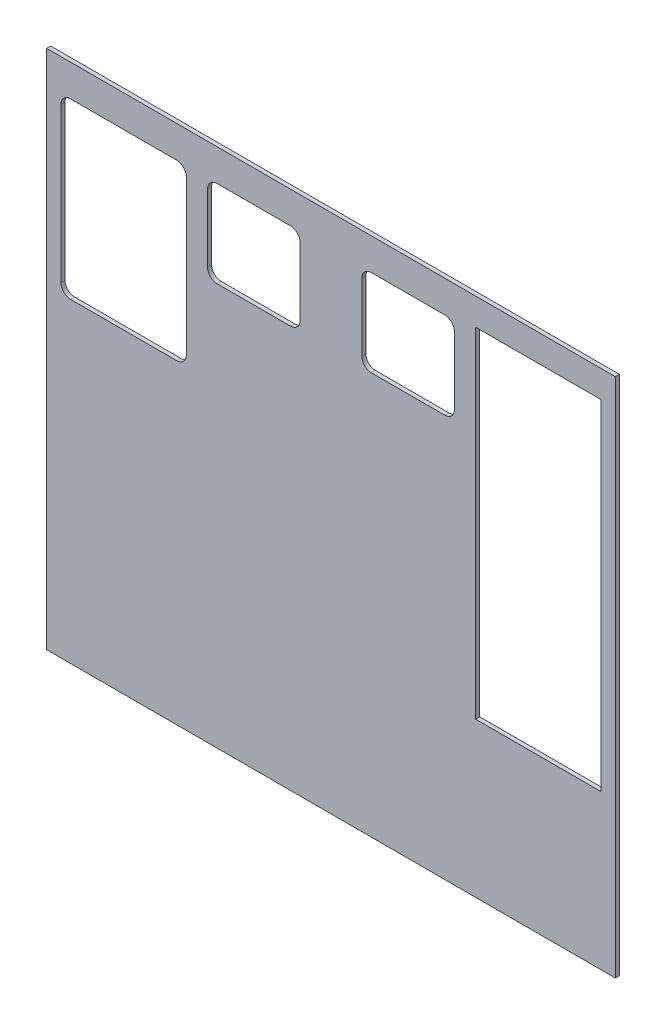
ISO-10303-21;
HEADER;
FILE_DESCRIPTION(('STEP AP214'),'2;1');
FILE_NAME('part.step','',(''),(''),'','','');
FILE_SCHEMA(('AUTOMOTIVE_DESIGN { 1 0 10303 214 1 1 1 1 }'));
ENDSEC;
DATA;
#1=APPLICATION_CONTEXT('core data for automotive mechanical design processes');
#2=APPLICATION_PROTOCOL_DEFINITION('international standard','automotive_design',2000,#1);
#3=PRODUCT_CONTEXT('',#1,'mechanical');
#4=PRODUCT('Part','Part','',(#3));
#5=PRODUCT_RELATED_PRODUCT_CATEGORY('part','',(#4));
#6=PRODUCT_DEFINITION_FORMATION('','',#4);
#7=PRODUCT_DEFINITION_CONTEXT('part definition',#1,'design');
#8=PRODUCT_DEFINITION('design','',#6,#7);
#9=PRODUCT_DEFINITION_SHAPE('','',#8);
#10=(LENGTH_UNIT() NAMED_UNIT(*) SI_UNIT(.MILLI.,.METRE.));
#11=(NAMED_UNIT(*) PLANE_ANGLE_UNIT() SI_UNIT($,.RADIAN.));
#12=(NAMED_UNIT(*) SI_UNIT($,.STERADIAN.) SOLID_ANGLE_UNIT());
#13=UNCERTAINTY_MEASURE_WITH_UNIT(LENGTH_MEASURE(1.E-05),#10,'distance_accuracy_value','');
#14=(GEOMETRIC_REPRESENTATION_CONTEXT(3) GLOBAL_UNCERTAINTY_ASSIGNED_CONTEXT((#13)) GLOBAL_UNIT_ASSIGNED_CONTEXT((#10,
#11,#12)) REPRESENTATION_CONTEXT('',''));
#15=CARTESIAN_POINT('',(0.,0.,0.));
#16=DIRECTION('',(0.,0.,1.));
#17=DIRECTION('',(1.,0.,0.));
#18=AXIS2_PLACEMENT_3D('',#15,#16,#17);
#19=CARTESIAN_POINT('',(0.,0.,2.667));
#20=DIRECTION('',(0.,-1.,0.));
#21=DIRECTION('',(1.,0.,0.));
#22=AXIS2_PLACEMENT_3D('',#19,#20,#21);
#23=PLANE('',#22);
#24=DIRECTION('',(0.,0.,1.));
#25=VECTOR('',#24,1.);
#26=CARTESIAN_POINT('',(-187.198,0.,0.));
#27=LINE('',#26,#25);
#28=CARTESIAN_POINT('',(-187.198,0.,0.));
#29=VERTEX_POINT('',#28);
#30=CARTESIAN_POINT('',(-187.198,0.,2.667));
#31=VERTEX_POINT('',#30);
#32=EDGE_CURVE('E843',#29,#31,#27,.T.);
#33=ORIENTED_EDGE('',*,*,#32,.F.);
#34=DIRECTION('',(-1.,0.,0.));
#35=VECTOR('',#34,1.);
#36=CARTESIAN_POINT('',(0.,0.,0.));
#37=LINE('',#36,#35);
#38=CARTESIAN_POINT('',(187.198,0.,0.));
#39=VERTEX_POINT('',#38);
#40=EDGE_CURVE('E317',#39,#29,#37,.T.);
#41=ORIENTED_EDGE('',*,*,#40,.F.);
#42=DIRECTION('',(0.,0.,1.));
#43=VECTOR('',#42,1.);
#44=CARTESIAN_POINT('',(187.198,0.,0.));
#45=LINE('',#44,#43);
#46=CARTESIAN_POINT('',(187.198,0.,2.667));
#47=VERTEX_POINT('',#46);
#48=EDGE_CURVE('E54',#39,#47,#45,.T.);
#49=ORIENTED_EDGE('',*,*,#48,.T.);
#50=DIRECTION('',(-1.,0.,0.));
#51=VECTOR('',#50,1.);
#52=CARTESIAN_POINT('',(0.,0.,2.667));
#53=LINE('',#52,#51);
#54=EDGE_CURVE('E478',#47,#31,#53,.T.);
#55=ORIENTED_EDGE('',*,*,#54,.T.);
#56=EDGE_LOOP('',(#33,#41,#49,#55));
#57=FACE_BOUND('',#56,.T.);
#58=ADVANCED_FACE('F37',(#57),#23,.T.);
#59=CARTESIAN_POINT('',(3.7031781150326E-13,321.945,2.667));
#60=DIRECTION('',(0.,-1.,0.));
#61=DIRECTION('',(1.,0.,0.));
#62=AXIS2_PLACEMENT_3D('',#59,#60,#61);
#63=PLANE('',#62);
#64=DIRECTION('',(-1.,0.,0.));
#65=VECTOR('',#64,1.);
#66=CARTESIAN_POINT('',(3.7031781150326E-13,321.945,0.));
#67=LINE('',#66,#65);
#68=CARTESIAN_POINT('',(74.93,321.945,0.));
#69=VERTEX_POINT('',#68);
#70=CARTESIAN_POINT('',(26.67,321.945,0.));
#71=VERTEX_POINT('',#70);
#72=EDGE_CURVE('E332',#69,#71,#67,.T.);
#73=ORIENTED_EDGE('',*,*,#72,.F.);
#74=DIRECTION('',(0.,0.,-1.));
#75=VECTOR('',#74,1.);
#76=CARTESIAN_POINT('',(74.93,321.945,2.667));
#77=LINE('',#76,#75);
#78=CARTESIAN_POINT('',(74.93,321.945,2.667));
#79=VERTEX_POINT('',#78);
#80=EDGE_CURVE('E11',#79,#69,#77,.T.);
#81=ORIENTED_EDGE('',*,*,#80,.F.);
#82=DIRECTION('',(-1.,0.,0.));
#83=VECTOR('',#82,1.);
#84=CARTESIAN_POINT('',(3.7031781150326E-13,321.945,2.667));
#85=LINE('',#84,#83);
#86=CARTESIAN_POINT('',(26.67,321.945,2.667));
#87=VERTEX_POINT('',#86);
#88=EDGE_CURVE('E492',#79,#87,#85,.T.);
#89=ORIENTED_EDGE('',*,*,#88,.T.);
#90=DIRECTION('',(0.,0.,-1.));
#91=VECTOR('',#90,1.);
#92=CARTESIAN_POINT('',(26.67,321.945,2.667));
#93=LINE('',#92,#91);
#94=EDGE_CURVE('E156',#87,#71,#93,.T.);
#95=ORIENTED_EDGE('',*,*,#94,.T.);
#96=EDGE_LOOP('',(#73,#81,#89,#95));
#97=FACE_BOUND('',#96,.T.);
#98=ADVANCED_FACE('F512',(#97),#63,.T.);
#99=CARTESIAN_POINT('',(74.93,315.595,2.667));
#100=DIRECTION('',(0.,0.,-1.));
#101=DIRECTION('',(-1.,0.,0.));
#102=AXIS2_PLACEMENT_3D('',#99,#100,#101);
#103=CYLINDRICAL_SURFACE('',#102,6.35000000000002);
#104=CARTESIAN_POINT('',(74.93,315.595,0.));
#105=DIRECTION('',(0.,0.,1.));
#106=DIRECTION('',(1.,0.,0.));
#107=AXIS2_PLACEMENT_3D('',#104,#105,#106);
#108=CIRCLE('',#107,6.35000000000002);
#109=CARTESIAN_POINT('',(81.28,315.595,0.));
#110=VERTEX_POINT('',#109);
#111=EDGE_CURVE('E335',#69,#110,#108,.F.);
#112=ORIENTED_EDGE('',*,*,#111,.T.);
#113=DIRECTION('',(0.,0.,-1.));
#114=VECTOR('',#113,1.);
#115=CARTESIAN_POINT('',(81.28,315.595,2.667));
#116=LINE('',#115,#114);
#117=CARTESIAN_POINT('',(81.28,315.595,2.667));
#118=VERTEX_POINT('',#117);
#119=EDGE_CURVE('E46',#118,#110,#116,.T.);
#120=ORIENTED_EDGE('',*,*,#119,.F.);
#121=CARTESIAN_POINT('',(74.93,315.595,2.667));
#122=DIRECTION('',(0.,0.,1.));
#123=DIRECTION('',(1.,0.,0.));
#124=AXIS2_PLACEMENT_3D('',#121,#122,#123);
#125=CIRCLE('',#124,6.35000000000002);
#126=EDGE_CURVE('E494',#79,#118,#125,.F.);
#127=ORIENTED_EDGE('',*,*,#126,.F.);
#128=ORIENTED_EDGE('',*,*,#80,.T.);
#129=EDGE_LOOP('',(#112,#120,#127,#128));
#130=FACE_BOUND('',#129,.T.);
#131=ADVANCED_FACE('F516',(#130),#103,.F.);
#132=CARTESIAN_POINT('',(81.2799999999999,0.,2.667));
#133=DIRECTION('',(1.,0.,0.));
#134=DIRECTION('',(0.,1.,0.));
#135=AXIS2_PLACEMENT_3D('',#132,#133,#134);
#136=PLANE('',#135);
#137=DIRECTION('',(0.,-1.,0.));
#138=VECTOR('',#137,1.);
#139=CARTESIAN_POINT('',(81.2799999999999,0.,0.));
#140=LINE('',#139,#138);
#141=CARTESIAN_POINT('',(81.28,271.145,0.));
#142=VERTEX_POINT('',#141);
#143=EDGE_CURVE('E338',#110,#142,#140,.T.);
#144=ORIENTED_EDGE('',*,*,#143,.T.);
#145=DIRECTION('',(0.,0.,-1.));
#146=VECTOR('',#145,1.);
#147=CARTESIAN_POINT('',(81.28,271.145,2.667));
#148=LINE('',#147,#146);
#149=CARTESIAN_POINT('',(81.28,271.145,2.667));
#150=VERTEX_POINT('',#149);
#151=EDGE_CURVE('E360',#150,#142,#148,.T.);
#152=ORIENTED_EDGE('',*,*,#151,.F.);
#153=DIRECTION('',(0.,-1.,0.));
#154=VECTOR('',#153,1.);
#155=CARTESIAN_POINT('',(81.2799999999999,0.,2.667));
#156=LINE('',#155,#154);
#157=EDGE_CURVE('E497',#118,#150,#156,.T.);
#158=ORIENTED_EDGE('',*,*,#157,.F.);
#159=ORIENTED_EDGE('',*,*,#119,.T.);
#160=EDGE_LOOP('',(#144,#152,#158,#159));
#161=FACE_BOUND('',#160,.T.);
#162=ADVANCED_FACE('F518',(#161),#136,.F.);
#163=CARTESIAN_POINT('',(74.93,271.145,2.667));
#164=DIRECTION('',(0.,0.,-1.));
#165=DIRECTION('',(-1.,0.,0.));
#166=AXIS2_PLACEMENT_3D('',#163,#164,#165);
#167=CYLINDRICAL_SURFACE('',#166,6.35000000000001);
#168=CARTESIAN_POINT('',(74.93,271.145,0.));
#169=DIRECTION('',(0.,0.,1.));
#170=DIRECTION('',(1.,0.,0.));
#171=AXIS2_PLACEMENT_3D('',#168,#169,#170);
#172=CIRCLE('',#171,6.35000000000001);
#173=CARTESIAN_POINT('',(74.93,264.795,0.));
#174=VERTEX_POINT('',#173);
#175=EDGE_CURVE('E341',#142,#174,#172,.F.);
#176=ORIENTED_EDGE('',*,*,#175,.T.);
#177=DIRECTION('',(0.,0.,-1.));
#178=VECTOR('',#177,1.);
#179=CARTESIAN_POINT('',(74.93,264.795,2.667));
#180=LINE('',#179,#178);
#181=CARTESIAN_POINT('',(74.93,264.795,2.667));
#182=VERTEX_POINT('',#181);
#183=EDGE_CURVE('E357',#182,#174,#180,.T.);
#184=ORIENTED_EDGE('',*,*,#183,.F.);
#185=CARTESIAN_POINT('',(74.93,271.145,2.667));
#186=DIRECTION('',(0.,0.,1.));
#187=DIRECTION('',(1.,0.,0.));
#188=AXIS2_PLACEMENT_3D('',#185,#186,#187);
#189=CIRCLE('',#188,6.35000000000001);
#190=EDGE_CURVE('E500',#150,#182,#189,.F.);
#191=ORIENTED_EDGE('',*,*,#190,.F.);
#192=ORIENTED_EDGE('',*,*,#151,.T.);
#193=EDGE_LOOP('',(#176,#184,#191,#192));
#194=FACE_BOUND('',#193,.T.);
#195=ADVANCED_FACE('F504',(#194),#167,.F.);
#196=CARTESIAN_POINT('',(3.04580921887296E-13,264.795,2.667));
#197=DIRECTION('',(0.,-1.,0.));
#198=DIRECTION('',(1.,0.,0.));
#199=AXIS2_PLACEMENT_3D('',#196,#197,#198);
#200=PLANE('',#199);
#201=DIRECTION('',(-1.,0.,0.));
#202=VECTOR('',#201,1.);
#203=CARTESIAN_POINT('',(3.04580921887296E-13,264.795,0.));
#204=LINE('',#203,#202);
#205=CARTESIAN_POINT('',(26.67,264.795,0.));
#206=VERTEX_POINT('',#205);
#207=EDGE_CURVE('E344',#174,#206,#204,.T.);
#208=ORIENTED_EDGE('',*,*,#207,.T.);
#209=DIRECTION('',(0.,0.,-1.));
#210=VECTOR('',#209,1.);
#211=CARTESIAN_POINT('',(26.67,264.795,2.667));
#212=LINE('',#211,#210);
#213=CARTESIAN_POINT('',(26.67,264.795,2.667));
#214=VERTEX_POINT('',#213);
#215=EDGE_CURVE('E259',#214,#206,#212,.T.);
#216=ORIENTED_EDGE('',*,*,#215,.F.);
#217=DIRECTION('',(-1.,0.,0.));
#218=VECTOR('',#217,1.);
#219=CARTESIAN_POINT('',(3.04580921887296E-13,264.795,2.667));
#220=LINE('',#219,#218);
#221=EDGE_CURVE('E247',#182,#214,#220,.T.);
#222=ORIENTED_EDGE('',*,*,#221,.F.);
#223=ORIENTED_EDGE('',*,*,#183,.T.);
#224=EDGE_LOOP('',(#208,#216,#222,#223));
#225=FACE_BOUND('',#224,.T.);
#226=ADVANCED_FACE('F506',(#225),#200,.F.);
#227=CARTESIAN_POINT('',(26.67,271.145,2.667));
#228=DIRECTION('',(0.,0.,-1.));
#229=DIRECTION('',(-1.,0.,0.));
#230=AXIS2_PLACEMENT_3D('',#227,#228,#229);
#231=CYLINDRICAL_SURFACE('',#230,6.35000000000001);
#232=CARTESIAN_POINT('',(26.67,271.145,0.));
#233=DIRECTION('',(0.,0.,1.));
#234=DIRECTION('',(1.,0.,0.));
#235=AXIS2_PLACEMENT_3D('',#232,#233,#234);
#236=CIRCLE('',#235,6.35000000000001);
#237=CARTESIAN_POINT('',(20.32,271.145,0.));
#238=VERTEX_POINT('',#237);
#239=EDGE_CURVE('E255',#206,#238,#236,.F.);
#240=ORIENTED_EDGE('',*,*,#239,.T.);
#241=DIRECTION('',(0.,0.,-1.));
#242=VECTOR('',#241,1.);
#243=CARTESIAN_POINT('',(20.32,271.145,2.667));
#244=LINE('',#243,#242);
#245=CARTESIAN_POINT('',(20.32,271.145,2.667));
#246=VERTEX_POINT('',#245);
#247=EDGE_CURVE('E253',#246,#238,#244,.T.);
#248=ORIENTED_EDGE('',*,*,#247,.F.);
#249=CARTESIAN_POINT('',(26.67,271.145,2.667));
#250=DIRECTION('',(0.,0.,1.));
#251=DIRECTION('',(1.,0.,0.));
#252=AXIS2_PLACEMENT_3D('',#249,#250,#251);
#253=CIRCLE('',#252,6.35000000000001);
#254=EDGE_CURVE('E241',#214,#246,#253,.F.);
#255=ORIENTED_EDGE('',*,*,#254,.F.);
#256=ORIENTED_EDGE('',*,*,#215,.T.);
#257=EDGE_LOOP('',(#240,#248,#255,#256));
#258=FACE_BOUND('',#257,.T.);
#259=ADVANCED_FACE('F254',(#258),#231,.F.);
#260=CARTESIAN_POINT('',(20.3199999999999,0.,2.667));
#261=DIRECTION('',(1.,0.,0.));
#262=DIRECTION('',(0.,1.,0.));
#263=AXIS2_PLACEMENT_3D('',#260,#261,#262);
#264=PLANE('',#263);
#265=DIRECTION('',(0.,-1.,0.));
#266=VECTOR('',#265,1.);
#267=CARTESIAN_POINT('',(20.3199999999999,0.,0.));
#268=LINE('',#267,#266);
#269=CARTESIAN_POINT('',(20.32,315.595,0.));
#270=VERTEX_POINT('',#269);
#271=EDGE_CURVE('E348',#270,#238,#268,.T.);
#272=ORIENTED_EDGE('',*,*,#271,.F.);
#273=DIRECTION('',(0.,0.,-1.));
#274=VECTOR('',#273,1.);
#275=CARTESIAN_POINT('',(20.32,315.595,2.667));
#276=LINE('',#275,#274);
#277=CARTESIAN_POINT('',(20.32,315.595,2.667));
#278=VERTEX_POINT('',#277);
#279=EDGE_CURVE('E260',#278,#270,#276,.T.);
#280=ORIENTED_EDGE('',*,*,#279,.F.);
#281=DIRECTION('',(0.,-1.,0.));
#282=VECTOR('',#281,1.);
#283=CARTESIAN_POINT('',(20.3199999999999,0.,2.667));
#284=LINE('',#283,#282);
#285=EDGE_CURVE('E245',#278,#246,#284,.T.);
#286=ORIENTED_EDGE('',*,*,#285,.T.);
#287=ORIENTED_EDGE('',*,*,#247,.T.);
#288=EDGE_LOOP('',(#272,#280,#286,#287));
#289=FACE_BOUND('',#288,.T.);
#290=ADVANCED_FACE('F262',(#289),#264,.T.);
#291=CARTESIAN_POINT('',(0.,325.12,2.667));
#292=DIRECTION('',(0.,1.,0.));
#293=DIRECTION('',(0.,0.,1.));
#294=AXIS2_PLACEMENT_3D('',#291,#292,#293);
#295=PLANE('',#294);
#296=DIRECTION('',(1.,0.,0.));
#297=VECTOR('',#296,1.);
#298=CARTESIAN_POINT('',(0.,325.12,0.));
#299=LINE('',#298,#297);
#300=CARTESIAN_POINT('',(95.25,325.12,0.));
#301=VERTEX_POINT('',#300);
#302=CARTESIAN_POINT('',(177.8,325.12,0.));
#303=VERTEX_POINT('',#302);
#304=EDGE_CURVE('E320',#301,#303,#299,.T.);
#305=ORIENTED_EDGE('',*,*,#304,.T.);
#306=DIRECTION('',(0.,0.,-1.));
#307=VECTOR('',#306,1.);
#308=CARTESIAN_POINT('',(177.8,325.12,2.667));
#309=LINE('',#308,#307);
#310=CARTESIAN_POINT('',(177.8,325.12,2.667));
#311=VERTEX_POINT('',#310);
#312=EDGE_CURVE('E354',#311,#303,#309,.T.);
#313=ORIENTED_EDGE('',*,*,#312,.F.);
#314=DIRECTION('',(1.,0.,0.));
#315=VECTOR('',#314,1.);
#316=CARTESIAN_POINT('',(0.,325.12,2.667));
#317=LINE('',#316,#315);
#318=CARTESIAN_POINT('',(95.25,325.12,2.667));
#319=VERTEX_POINT('',#318);
#320=EDGE_CURVE('E481',#319,#311,#317,.T.);
#321=ORIENTED_EDGE('',*,*,#320,.F.);
#322=DIRECTION('',(0.,0.,-1.));
#323=VECTOR('',#322,1.);
#324=CARTESIAN_POINT('',(95.25,325.12,2.667));
#325=LINE('',#324,#323);
#326=EDGE_CURVE('E365',#319,#301,#325,.T.);
#327=ORIENTED_EDGE('',*,*,#326,.T.);
#328=EDGE_LOOP('',(#305,#313,#321,#327));
#329=FACE_BOUND('',#328,.T.);
#330=ADVANCED_FACE('F537',(#329),#295,.F.);
#331=CARTESIAN_POINT('',(177.8,0.,2.667));
#332=DIRECTION('',(1.,0.,0.));
#333=DIRECTION('',(0.,0.,-1.));
#334=AXIS2_PLACEMENT_3D('',#331,#332,#333);
#335=PLANE('',#334);
#336=DIRECTION('',(0.,-1.,0.));
#337=VECTOR('',#336,1.);
#338=CARTESIAN_POINT('',(177.8,0.,0.));
#339=LINE('',#338,#337);
#340=CARTESIAN_POINT('',(177.8,101.6,0.));
#341=VERTEX_POINT('',#340);
#342=EDGE_CURVE('E323',#303,#341,#339,.T.);
#343=ORIENTED_EDGE('',*,*,#342,.T.);
#344=DIRECTION('',(0.,0.,-1.));
#345=VECTOR('',#344,1.);
#346=CARTESIAN_POINT('',(177.8,101.6,2.667));
#347=LINE('',#346,#345);
#348=CARTESIAN_POINT('',(177.8,101.6,2.667));
#349=VERTEX_POINT('',#348);
#350=EDGE_CURVE('E370',#349,#341,#347,.T.);
#351=ORIENTED_EDGE('',*,*,#350,.F.);
#352=DIRECTION('',(0.,-1.,0.));
#353=VECTOR('',#352,1.);
#354=CARTESIAN_POINT('',(177.8,0.,2.667));
#355=LINE('',#354,#353);
#356=EDGE_CURVE('E484',#311,#349,#355,.T.);
#357=ORIENTED_EDGE('',*,*,#356,.F.);
#358=ORIENTED_EDGE('',*,*,#312,.T.);
#359=EDGE_LOOP('',(#343,#351,#357,#358));
#360=FACE_BOUND('',#359,.T.);
#361=ADVANCED_FACE('F624',(#360),#335,.F.);
#362=CARTESIAN_POINT('',(0.,101.6,2.667));
#363=DIRECTION('',(0.,1.,0.));
#364=DIRECTION('',(0.,0.,1.));
#365=AXIS2_PLACEMENT_3D('',#362,#363,#364);
#366=PLANE('',#365);
#367=DIRECTION('',(1.,0.,0.));
#368=VECTOR('',#367,1.);
#369=CARTESIAN_POINT('',(0.,101.6,0.));
#370=LINE('',#369,#368);
#371=CARTESIAN_POINT('',(95.25,101.6,0.));
#372=VERTEX_POINT('',#371);
#373=EDGE_CURVE('E326',#372,#341,#370,.T.);
#374=ORIENTED_EDGE('',*,*,#373,.F.);
#375=DIRECTION('',(0.,0.,-1.));
#376=VECTOR('',#375,1.);
#377=CARTESIAN_POINT('',(95.25,101.6,2.667));
#378=LINE('',#377,#376);
#379=CARTESIAN_POINT('',(95.25,101.6,2.667));
#380=VERTEX_POINT('',#379);
#381=EDGE_CURVE('E367',#380,#372,#378,.T.);
#382=ORIENTED_EDGE('',*,*,#381,.F.);
#383=DIRECTION('',(1.,0.,0.));
#384=VECTOR('',#383,1.);
#385=CARTESIAN_POINT('',(0.,101.6,2.667));
#386=LINE('',#385,#384);
#387=EDGE_CURVE('E486',#380,#349,#386,.T.);
#388=ORIENTED_EDGE('',*,*,#387,.T.);
#389=ORIENTED_EDGE('',*,*,#350,.T.);
#390=EDGE_LOOP('',(#374,#382,#388,#389));
#391=FACE_BOUND('',#390,.T.);
#392=ADVANCED_FACE('F571',(#391),#366,.T.);
#393=CARTESIAN_POINT('',(-171.45,315.595,2.667));
#394=DIRECTION('',(0.,0.,-1.));
#395=DIRECTION('',(-1.,0.,0.));
#396=AXIS2_PLACEMENT_3D('',#393,#394,#395);
#397=CYLINDRICAL_SURFACE('',#396,6.35000000000001);
#398=CARTESIAN_POINT('',(-171.45,315.595,0.));
#399=DIRECTION('',(0.,0.,1.));
#400=DIRECTION('',(1.,0.,0.));
#401=AXIS2_PLACEMENT_3D('',#398,#399,#400);
#402=CIRCLE('',#401,6.35000000000001);
#403=CARTESIAN_POINT('',(-171.45,321.945,0.));
#404=VERTEX_POINT('',#403);
#405=CARTESIAN_POINT('',(-177.8,315.595,0.));
#406=VERTEX_POINT('',#405);
#407=EDGE_CURVE('E293',#404,#406,#402,.T.);
#408=ORIENTED_EDGE('',*,*,#407,.F.);
#409=DIRECTION('',(0.,0.,-1.));
#410=VECTOR('',#409,1.);
#411=CARTESIAN_POINT('',(-171.45,321.945,2.667));
#412=LINE('',#411,#410);
#413=CARTESIAN_POINT('',(-171.45,321.945,2.667));
#414=VERTEX_POINT('',#413);
#415=EDGE_CURVE('E368',#414,#404,#412,.T.);
#416=ORIENTED_EDGE('',*,*,#415,.F.);
#417=CARTESIAN_POINT('',(-171.45,315.595,2.667));
#418=DIRECTION('',(0.,0.,1.));
#419=DIRECTION('',(1.,0.,0.));
#420=AXIS2_PLACEMENT_3D('',#417,#418,#419);
#421=CIRCLE('',#420,6.35000000000001);
#422=CARTESIAN_POINT('',(-177.8,315.595,2.667));
#423=VERTEX_POINT('',#422);
#424=EDGE_CURVE('E456',#414,#423,#421,.T.);
#425=ORIENTED_EDGE('',*,*,#424,.T.);
#426=DIRECTION('',(0.,0.,-1.));
#427=VECTOR('',#426,1.);
#428=CARTESIAN_POINT('',(-177.8,315.595,2.667));
#429=LINE('',#428,#427);
#430=EDGE_CURVE('E374',#423,#406,#429,.T.);
#431=ORIENTED_EDGE('',*,*,#430,.T.);
#432=EDGE_LOOP('',(#408,#416,#425,#431));
#433=FACE_BOUND('',#432,.T.);
#434=ADVANCED_FACE('F567',(#433),#397,.F.);
#435=CARTESIAN_POINT('',(2.55855942493161E-13,321.945,2.667));
#436=DIRECTION('',(0.,1.,0.));
#437=DIRECTION('',(-1.,0.,0.));
#438=AXIS2_PLACEMENT_3D('',#435,#436,#437);
#439=PLANE('',#438);
#440=DIRECTION('',(1.,0.,0.));
#441=VECTOR('',#440,1.);
#442=CARTESIAN_POINT('',(2.55855942493161E-13,321.945,0.));
#443=LINE('',#442,#441);
#444=CARTESIAN_POINT('',(-101.6,321.945,0.));
#445=VERTEX_POINT('',#444);
#446=EDGE_CURVE('E296',#404,#445,#443,.T.);
#447=ORIENTED_EDGE('',*,*,#446,.T.);
#448=DIRECTION('',(0.,0.,-1.));
#449=VECTOR('',#448,1.);
#450=CARTESIAN_POINT('',(-101.6,321.945,2.667));
#451=LINE('',#450,#449);
#452=CARTESIAN_POINT('',(-101.6,321.945,2.667));
#453=VERTEX_POINT('',#452);
#454=EDGE_CURVE('E386',#453,#445,#451,.T.);
#455=ORIENTED_EDGE('',*,*,#454,.F.);
#456=DIRECTION('',(1.,0.,0.));
#457=VECTOR('',#456,1.);
#458=CARTESIAN_POINT('',(2.55855942493161E-13,321.945,2.667));
#459=LINE('',#458,#457);
#460=EDGE_CURVE('E459',#414,#453,#459,.T.);
#461=ORIENTED_EDGE('',*,*,#460,.F.);
#462=ORIENTED_EDGE('',*,*,#415,.T.);
#463=EDGE_LOOP('',(#447,#455,#461,#462));
#464=FACE_BOUND('',#463,.T.);
#465=ADVANCED_FACE('F563',(#464),#439,.F.);
#466=CARTESIAN_POINT('',(-101.6,315.595,2.667));
#467=DIRECTION('',(0.,0.,-1.));
#468=DIRECTION('',(-1.,0.,0.));
#469=AXIS2_PLACEMENT_3D('',#466,#467,#468);
#470=CYLINDRICAL_SURFACE('',#469,6.34999999999998);
#471=CARTESIAN_POINT('',(-101.6,315.595,0.));
#472=DIRECTION('',(0.,0.,1.));
#473=DIRECTION('',(1.,0.,0.));
#474=AXIS2_PLACEMENT_3D('',#471,#472,#473);
#475=CIRCLE('',#474,6.34999999999998);
#476=CARTESIAN_POINT('',(-95.2500000000002,315.595,0.));
#477=VERTEX_POINT('',#476);
#478=EDGE_CURVE('E299',#477,#445,#475,.T.);
#479=ORIENTED_EDGE('',*,*,#478,.F.);
#480=DIRECTION('',(0.,0.,-1.));
#481=VECTOR('',#480,1.);
#482=CARTESIAN_POINT('',(-95.2500000000002,315.595,2.667));
#483=LINE('',#482,#481);
#484=CARTESIAN_POINT('',(-95.2500000000002,315.595,2.667));
#485=VERTEX_POINT('',#484);
#486=EDGE_CURVE('E384',#485,#477,#483,.T.);
#487=ORIENTED_EDGE('',*,*,#486,.F.);
#488=CARTESIAN_POINT('',(-101.6,315.595,2.667));
#489=DIRECTION('',(0.,0.,1.));
#490=DIRECTION('',(1.,0.,0.));
#491=AXIS2_PLACEMENT_3D('',#488,#489,#490);
#492=CIRCLE('',#491,6.34999999999998);
#493=EDGE_CURVE('E461',#485,#453,#492,.T.);
#494=ORIENTED_EDGE('',*,*,#493,.T.);
#495=ORIENTED_EDGE('',*,*,#454,.T.);
#496=EDGE_LOOP('',(#479,#487,#494,#495));
#497=FACE_BOUND('',#496,.T.);
#498=ADVANCED_FACE('F559',(#497),#470,.F.);
#499=CARTESIAN_POINT('',(-95.2500000000002,0.,2.667));
#500=DIRECTION('',(1.,0.,0.));
#501=DIRECTION('',(0.,1.,0.));
#502=AXIS2_PLACEMENT_3D('',#499,#500,#501);
#503=PLANE('',#502);
#504=DIRECTION('',(0.,-1.,0.));
#505=VECTOR('',#504,1.);
#506=CARTESIAN_POINT('',(-95.2500000000002,0.,0.));
#507=LINE('',#506,#505);
#508=CARTESIAN_POINT('',(-95.2500000000002,213.995,0.));
#509=VERTEX_POINT('',#508);
#510=EDGE_CURVE('E302',#477,#509,#507,.T.);
#511=ORIENTED_EDGE('',*,*,#510,.T.);
#512=DIRECTION('',(0.,0.,-1.));
#513=VECTOR('',#512,1.);
#514=CARTESIAN_POINT('',(-95.2500000000002,213.995,2.667));
#515=LINE('',#514,#513);
#516=CARTESIAN_POINT('',(-95.2500000000002,213.995,2.667));
#517=VERTEX_POINT('',#516);
#518=EDGE_CURVE('E382',#517,#509,#515,.T.);
#519=ORIENTED_EDGE('',*,*,#518,.F.);
#520=DIRECTION('',(0.,-1.,0.));
#521=VECTOR('',#520,1.);
#522=CARTESIAN_POINT('',(-95.2500000000002,0.,2.667));
#523=LINE('',#522,#521);
#524=EDGE_CURVE('E464',#485,#517,#523,.T.);
#525=ORIENTED_EDGE('',*,*,#524,.F.);
#526=ORIENTED_EDGE('',*,*,#486,.T.);
#527=EDGE_LOOP('',(#511,#519,#525,#526));
#528=FACE_BOUND('',#527,.T.);
#529=ADVANCED_FACE('F555',(#528),#503,.F.);
#530=CARTESIAN_POINT('',(-101.6,213.995,2.667));
#531=DIRECTION('',(0.,0.,-1.));
#532=DIRECTION('',(-1.,0.,0.));
#533=AXIS2_PLACEMENT_3D('',#530,#531,#532);
#534=CYLINDRICAL_SURFACE('',#533,6.35000000000001);
#535=CARTESIAN_POINT('',(-101.6,213.995,0.));
#536=DIRECTION('',(0.,0.,1.));
#537=DIRECTION('',(1.,0.,0.));
#538=AXIS2_PLACEMENT_3D('',#535,#536,#537);
#539=CIRCLE('',#538,6.35000000000001);
#540=CARTESIAN_POINT('',(-101.6,207.645,0.));
#541=VERTEX_POINT('',#540);
#542=EDGE_CURVE('E305',#541,#509,#539,.T.);
#543=ORIENTED_EDGE('',*,*,#542,.F.);
#544=DIRECTION('',(0.,0.,-1.));
#545=VECTOR('',#544,1.);
#546=CARTESIAN_POINT('',(-101.6,207.645,2.667));
#547=LINE('',#546,#545);
#548=CARTESIAN_POINT('',(-101.6,207.645,2.667));
#549=VERTEX_POINT('',#548);
#550=EDGE_CURVE('E380',#549,#541,#547,.T.);
#551=ORIENTED_EDGE('',*,*,#550,.F.);
#552=CARTESIAN_POINT('',(-101.6,213.995,2.667));
#553=DIRECTION('',(0.,0.,1.));
#554=DIRECTION('',(1.,0.,0.));
#555=AXIS2_PLACEMENT_3D('',#552,#553,#554);
#556=CIRCLE('',#555,6.35000000000001);
#557=EDGE_CURVE('E466',#549,#517,#556,.T.);
#558=ORIENTED_EDGE('',*,*,#557,.T.);
#559=ORIENTED_EDGE('',*,*,#518,.T.);
#560=EDGE_LOOP('',(#543,#551,#558,#559));
#561=FACE_BOUND('',#560,.T.);
#562=ADVANCED_FACE('F551',(#561),#534,.F.);
#563=CARTESIAN_POINT('',(0.,207.645,2.667));
#564=DIRECTION('',(0.,1.,0.));
#565=DIRECTION('',(0.,0.,1.));
#566=AXIS2_PLACEMENT_3D('',#563,#564,#565);
#567=PLANE('',#566);
#568=DIRECTION('',(1.,0.,0.));
#569=VECTOR('',#568,1.);
#570=CARTESIAN_POINT('',(0.,207.645,0.));
#571=LINE('',#570,#569);
#572=CARTESIAN_POINT('',(-171.45,207.645,0.));
#573=VERTEX_POINT('',#572);
#574=EDGE_CURVE('E308',#573,#541,#571,.T.);
#575=ORIENTED_EDGE('',*,*,#574,.F.);
#576=DIRECTION('',(0.,0.,-1.));
#577=VECTOR('',#576,1.);
#578=CARTESIAN_POINT('',(-171.45,207.645,2.667));
#579=LINE('',#578,#577);
#580=CARTESIAN_POINT('',(-171.45,207.645,2.667));
#581=VERTEX_POINT('',#580);
#582=EDGE_CURVE('E378',#581,#573,#579,.T.);
#583=ORIENTED_EDGE('',*,*,#582,.F.);
#584=DIRECTION('',(1.,0.,0.));
#585=VECTOR('',#584,1.);
#586=CARTESIAN_POINT('',(0.,207.645,2.667));
#587=LINE('',#586,#585);
#588=EDGE_CURVE('E469',#581,#549,#587,.T.);
#589=ORIENTED_EDGE('',*,*,#588,.T.);
#590=ORIENTED_EDGE('',*,*,#550,.T.);
#591=EDGE_LOOP('',(#575,#583,#589,#590));
#592=FACE_BOUND('',#591,.T.);
#593=ADVANCED_FACE('F547',(#592),#567,.T.);
#594=CARTESIAN_POINT('',(-171.45,213.995,2.667));
#595=DIRECTION('',(0.,0.,-1.));
#596=DIRECTION('',(-1.,0.,0.));
#597=AXIS2_PLACEMENT_3D('',#594,#595,#596);
#598=CYLINDRICAL_SURFACE('',#597,6.35000000000004);
#599=CARTESIAN_POINT('',(-171.45,213.995,0.));
#600=DIRECTION('',(0.,0.,1.));
#601=DIRECTION('',(1.,0.,0.));
#602=AXIS2_PLACEMENT_3D('',#599,#600,#601);
#603=CIRCLE('',#602,6.35000000000004);
#604=CARTESIAN_POINT('',(-177.8,213.995,0.));
#605=VERTEX_POINT('',#604);
#606=EDGE_CURVE('E311',#605,#573,#603,.T.);
#607=ORIENTED_EDGE('',*,*,#606,.F.);
#608=DIRECTION('',(0.,0.,-1.));
#609=VECTOR('',#608,1.);
#610=CARTESIAN_POINT('',(-177.8,213.995,2.667));
#611=LINE('',#610,#609);
#612=CARTESIAN_POINT('',(-177.8,213.995,2.667));
#613=VERTEX_POINT('',#612);
#614=EDGE_CURVE('E376',#613,#605,#611,.T.);
#615=ORIENTED_EDGE('',*,*,#614,.F.);
#616=CARTESIAN_POINT('',(-171.45,213.995,2.667));
#617=DIRECTION('',(0.,0.,1.));
#618=DIRECTION('',(1.,0.,0.));
#619=AXIS2_PLACEMENT_3D('',#616,#617,#618);
#620=CIRCLE('',#619,6.35000000000004);
#621=EDGE_CURVE('E472',#613,#581,#620,.T.);
#622=ORIENTED_EDGE('',*,*,#621,.T.);
#623=ORIENTED_EDGE('',*,*,#582,.T.);
#624=EDGE_LOOP('',(#607,#615,#622,#623));
#625=FACE_BOUND('',#624,.T.);
#626=ADVANCED_FACE('F544',(#625),#598,.F.);
#627=CARTESIAN_POINT('',(-74.93,315.595,2.667));
#628=DIRECTION('',(0.,0.,-1.));
#629=DIRECTION('',(-1.,0.,0.));
#630=AXIS2_PLACEMENT_3D('',#627,#628,#629);
#631=CYLINDRICAL_SURFACE('',#630,6.35000000000002);
#632=CARTESIAN_POINT('',(-74.93,315.595,0.));
#633=DIRECTION('',(0.,0.,1.));
#634=DIRECTION('',(1.,0.,0.));
#635=AXIS2_PLACEMENT_3D('',#632,#633,#634);
#636=CIRCLE('',#635,6.35000000000002);
#637=CARTESIAN_POINT('',(-74.93,321.945,0.));
#638=VERTEX_POINT('',#637);
#639=CARTESIAN_POINT('',(-81.28,315.595,0.));
#640=VERTEX_POINT('',#639);
#641=EDGE_CURVE('E268',#638,#640,#636,.T.);
#642=ORIENTED_EDGE('',*,*,#641,.F.);
#643=DIRECTION('',(0.,0.,-1.));
#644=VECTOR('',#643,1.);
#645=CARTESIAN_POINT('',(-74.93,321.945,2.667));
#646=LINE('',#645,#644);
#647=CARTESIAN_POINT('',(-74.93,321.945,2.667));
#648=VERTEX_POINT('',#647);
#649=EDGE_CURVE('E41',#648,#638,#646,.T.);
#650=ORIENTED_EDGE('',*,*,#649,.F.);
#651=CARTESIAN_POINT('',(-74.93,315.595,2.667));
#652=DIRECTION('',(0.,0.,1.));
#653=DIRECTION('',(1.,0.,0.));
#654=AXIS2_PLACEMENT_3D('',#651,#652,#653);
#655=CIRCLE('',#654,6.35000000000002);
#656=CARTESIAN_POINT('',(-81.28,315.595,2.667));
#657=VERTEX_POINT('',#656);
#658=EDGE_CURVE('E352',#648,#657,#655,.T.);
#659=ORIENTED_EDGE('',*,*,#658,.T.);
#660=DIRECTION('',(0.,0.,-1.));
#661=VECTOR('',#660,1.);
#662=CARTESIAN_POINT('',(-81.28,315.595,2.667));
#663=LINE('',#662,#661);
#664=EDGE_CURVE('E264',#657,#640,#663,.T.);
#665=ORIENTED_EDGE('',*,*,#664,.T.);
#666=EDGE_LOOP('',(#642,#650,#659,#665));
#667=FACE_BOUND('',#666,.T.);
#668=ADVANCED_FACE('F39',(#667),#631,.F.);
#669=CARTESIAN_POINT('',(-3.7031781150326E-13,321.945,2.667));
#670=DIRECTION('',(0.,1.,0.));
#671=DIRECTION('',(-1.,0.,0.));
#672=AXIS2_PLACEMENT_3D('',#669,#670,#671);
#673=PLANE('',#672);
#674=DIRECTION('',(1.,0.,0.));
#675=VECTOR('',#674,1.);
#676=CARTESIAN_POINT('',(-3.7031781150326E-13,321.945,0.));
#677=LINE('',#676,#675);
#678=CARTESIAN_POINT('',(-26.67,321.945,0.));
#679=VERTEX_POINT('',#678);
#680=EDGE_CURVE('E271',#638,#679,#677,.T.);
#681=ORIENTED_EDGE('',*,*,#680,.T.);
#682=DIRECTION('',(0.,0.,-1.));
#683=VECTOR('',#682,1.);
#684=CARTESIAN_POINT('',(-26.67,321.945,2.667));
#685=LINE('',#684,#683);
#686=CARTESIAN_POINT('',(-26.67,321.945,2.667));
#687=VERTEX_POINT('',#686);
#688=EDGE_CURVE('E399',#687,#679,#685,.T.);
#689=ORIENTED_EDGE('',*,*,#688,.F.);
#690=DIRECTION('',(1.,0.,0.));
#691=VECTOR('',#690,1.);
#692=CARTESIAN_POINT('',(-3.7031781150326E-13,321.945,2.667));
#693=LINE('',#692,#691);
#694=EDGE_CURVE('E407',#648,#687,#693,.T.);
#695=ORIENTED_EDGE('',*,*,#694,.F.);
#696=ORIENTED_EDGE('',*,*,#649,.T.);
#697=EDGE_LOOP('',(#681,#689,#695,#696));
#698=FACE_BOUND('',#697,.T.);
#699=ADVANCED_FACE('F406',(#698),#673,.F.);
#700=CARTESIAN_POINT('',(-26.67,315.595,2.667));
#701=DIRECTION('',(0.,0.,-1.));
#702=DIRECTION('',(-1.,0.,0.));
#703=AXIS2_PLACEMENT_3D('',#700,#701,#702);
#704=CYLINDRICAL_SURFACE('',#703,6.35000000000004);
#705=CARTESIAN_POINT('',(-26.67,315.595,0.));
#706=DIRECTION('',(0.,0.,1.));
#707=DIRECTION('',(1.,0.,0.));
#708=AXIS2_PLACEMENT_3D('',#705,#706,#707);
#709=CIRCLE('',#708,6.35000000000004);
#710=CARTESIAN_POINT('',(-20.32,315.595,0.));
#711=VERTEX_POINT('',#710);
#712=EDGE_CURVE('E275',#711,#679,#709,.T.);
#713=ORIENTED_EDGE('',*,*,#712,.F.);
#714=DIRECTION('',(0.,0.,-1.));
#715=VECTOR('',#714,1.);
#716=CARTESIAN_POINT('',(-20.32,315.595,2.667));
#717=LINE('',#716,#715);
#718=CARTESIAN_POINT('',(-20.32,315.595,2.667));
#719=VERTEX_POINT('',#718);
#720=EDGE_CURVE('E398',#719,#711,#717,.T.);
#721=ORIENTED_EDGE('',*,*,#720,.F.);
#722=CARTESIAN_POINT('',(-26.67,315.595,2.667));
#723=DIRECTION('',(0.,0.,1.));
#724=DIRECTION('',(1.,0.,0.));
#725=AXIS2_PLACEMENT_3D('',#722,#723,#724);
#726=CIRCLE('',#725,6.35000000000004);
#727=EDGE_CURVE('E441',#719,#687,#726,.T.);
#728=ORIENTED_EDGE('',*,*,#727,.T.);
#729=ORIENTED_EDGE('',*,*,#688,.T.);
#730=EDGE_LOOP('',(#713,#721,#728,#729));
#731=FACE_BOUND('',#730,.T.);
#732=ADVANCED_FACE('F438',(#731),#704,.F.);
#733=CARTESIAN_POINT('',(-20.3199999999999,0.,2.667));
#734=DIRECTION('',(1.,0.,0.));
#735=DIRECTION('',(0.,1.,0.));
#736=AXIS2_PLACEMENT_3D('',#733,#734,#735);
#737=PLANE('',#736);
#738=DIRECTION('',(0.,-1.,0.));
#739=VECTOR('',#738,1.);
#740=CARTESIAN_POINT('',(-20.3199999999999,0.,0.));
#741=LINE('',#740,#739);
#742=CARTESIAN_POINT('',(-20.32,271.145,0.));
#743=VERTEX_POINT('',#742);
#744=EDGE_CURVE('E278',#711,#743,#741,.T.);
#745=ORIENTED_EDGE('',*,*,#744,.T.);
#746=DIRECTION('',(0.,0.,-1.));
#747=VECTOR('',#746,1.);
#748=CARTESIAN_POINT('',(-20.32,271.145,2.667));
#749=LINE('',#748,#747);
#750=CARTESIAN_POINT('',(-20.32,271.145,2.667));
#751=VERTEX_POINT('',#750);
#752=EDGE_CURVE('E396',#751,#743,#749,.T.);
#753=ORIENTED_EDGE('',*,*,#752,.F.);
#754=DIRECTION('',(0.,-1.,0.));
#755=VECTOR('',#754,1.);
#756=CARTESIAN_POINT('',(-20.3199999999999,0.,2.667));
#757=LINE('',#756,#755);
#758=EDGE_CURVE('E442',#719,#751,#757,.T.);
#759=ORIENTED_EDGE('',*,*,#758,.F.);
#760=ORIENTED_EDGE('',*,*,#720,.T.);
#761=EDGE_LOOP('',(#745,#753,#759,#760));
#762=FACE_BOUND('',#761,.T.);
#763=ADVANCED_FACE('F443',(#762),#737,.F.);
#764=CARTESIAN_POINT('',(-26.67,271.145,2.667));
#765=DIRECTION('',(0.,0.,-1.));
#766=DIRECTION('',(-1.,0.,0.));
#767=AXIS2_PLACEMENT_3D('',#764,#765,#766);
#768=CYLINDRICAL_SURFACE('',#767,6.35000000000001);
#769=CARTESIAN_POINT('',(-26.67,271.145,0.));
#770=DIRECTION('',(0.,0.,1.));
#771=DIRECTION('',(1.,0.,0.));
#772=AXIS2_PLACEMENT_3D('',#769,#770,#771);
#773=CIRCLE('',#772,6.35000000000001);
#774=CARTESIAN_POINT('',(-26.67,264.795,0.));
#775=VERTEX_POINT('',#774);
#776=EDGE_CURVE('E281',#775,#743,#773,.T.);
#777=ORIENTED_EDGE('',*,*,#776,.F.);
#778=DIRECTION('',(0.,0.,-1.));
#779=VECTOR('',#778,1.);
#780=CARTESIAN_POINT('',(-26.67,264.795,2.667));
#781=LINE('',#780,#779);
#782=CARTESIAN_POINT('',(-26.67,264.795,2.667));
#783=VERTEX_POINT('',#782);
#784=EDGE_CURVE('E394',#783,#775,#781,.T.);
#785=ORIENTED_EDGE('',*,*,#784,.F.);
#786=CARTESIAN_POINT('',(-26.67,271.145,2.667));
#787=DIRECTION('',(0.,0.,1.));
#788=DIRECTION('',(1.,0.,0.));
#789=AXIS2_PLACEMENT_3D('',#786,#787,#788);
#790=CIRCLE('',#789,6.35000000000001);
#791=EDGE_CURVE('E445',#783,#751,#790,.T.);
#792=ORIENTED_EDGE('',*,*,#791,.T.);
#793=ORIENTED_EDGE('',*,*,#752,.T.);
#794=EDGE_LOOP('',(#777,#785,#792,#793));
#795=FACE_BOUND('',#794,.T.);
#796=ADVANCED_FACE('F435',(#795),#768,.F.);
#797=CARTESIAN_POINT('',(-3.04580921887296E-13,264.795,2.667));
#798=DIRECTION('',(0.,1.,0.));
#799=DIRECTION('',(-1.,0.,0.));
#800=AXIS2_PLACEMENT_3D('',#797,#798,#799);
#801=PLANE('',#800);
#802=DIRECTION('',(1.,0.,0.));
#803=VECTOR('',#802,1.);
#804=CARTESIAN_POINT('',(-3.04580921887296E-13,264.795,0.));
#805=LINE('',#804,#803);
#806=CARTESIAN_POINT('',(-74.93,264.795,0.));
#807=VERTEX_POINT('',#806);
#808=EDGE_CURVE('E284',#807,#775,#805,.T.);
#809=ORIENTED_EDGE('',*,*,#808,.F.);
#810=DIRECTION('',(0.,0.,-1.));
#811=VECTOR('',#810,1.);
#812=CARTESIAN_POINT('',(-74.93,264.795,2.667));
#813=LINE('',#812,#811);
#814=CARTESIAN_POINT('',(-74.93,264.795,2.667));
#815=VERTEX_POINT('',#814);
#816=EDGE_CURVE('E392',#815,#807,#813,.T.);
#817=ORIENTED_EDGE('',*,*,#816,.F.);
#818=DIRECTION('',(1.,0.,0.));
#819=VECTOR('',#818,1.);
#820=CARTESIAN_POINT('',(-3.04580921887296E-13,264.795,2.667));
#821=LINE('',#820,#819);
#822=EDGE_CURVE('E431',#815,#783,#821,.T.);
#823=ORIENTED_EDGE('',*,*,#822,.T.);
#824=ORIENTED_EDGE('',*,*,#784,.T.);
#825=EDGE_LOOP('',(#809,#817,#823,#824));
#826=FACE_BOUND('',#825,.T.);
#827=ADVANCED_FACE('F429',(#826),#801,.T.);
#828=CARTESIAN_POINT('',(-74.93,271.145,2.667));
#829=DIRECTION('',(0.,0.,-1.));
#830=DIRECTION('',(-1.,0.,0.));
#831=AXIS2_PLACEMENT_3D('',#828,#829,#830);
#832=CYLINDRICAL_SURFACE('',#831,6.35000000000001);
#833=CARTESIAN_POINT('',(-74.93,271.145,0.));
#834=DIRECTION('',(0.,0.,1.));
#835=DIRECTION('',(1.,0.,0.));
#836=AXIS2_PLACEMENT_3D('',#833,#834,#835);
#837=CIRCLE('',#836,6.35000000000001);
#838=CARTESIAN_POINT('',(-81.28,271.145,0.));
#839=VERTEX_POINT('',#838);
#840=EDGE_CURVE('E287',#839,#807,#837,.T.);
#841=ORIENTED_EDGE('',*,*,#840,.F.);
#842=DIRECTION('',(0.,0.,-1.));
#843=VECTOR('',#842,1.);
#844=CARTESIAN_POINT('',(-81.28,271.145,2.667));
#845=LINE('',#844,#843);
#846=CARTESIAN_POINT('',(-81.28,271.145,2.667));
#847=VERTEX_POINT('',#846);
#848=EDGE_CURVE('E390',#847,#839,#845,.T.);
#849=ORIENTED_EDGE('',*,*,#848,.F.);
#850=CARTESIAN_POINT('',(-74.93,271.145,2.667));
#851=DIRECTION('',(0.,0.,1.));
#852=DIRECTION('',(1.,0.,0.));
#853=AXIS2_PLACEMENT_3D('',#850,#851,#852);
#854=CIRCLE('',#853,6.35000000000001);
#855=EDGE_CURVE('E425',#847,#815,#854,.T.);
#856=ORIENTED_EDGE('',*,*,#855,.T.);
#857=ORIENTED_EDGE('',*,*,#816,.T.);
#858=EDGE_LOOP('',(#841,#849,#856,#857));
#859=FACE_BOUND('',#858,.T.);
#860=ADVANCED_FACE('F422',(#859),#832,.F.);
#861=CARTESIAN_POINT('',(95.25,0.,2.667));
#862=DIRECTION('',(1.,0.,0.));
#863=DIRECTION('',(0.,1.,0.));
#864=AXIS2_PLACEMENT_3D('',#861,#862,#863);
#865=PLANE('',#864);
#866=DIRECTION('',(0.,-1.,0.));
#867=VECTOR('',#866,1.);
#868=CARTESIAN_POINT('',(95.25,0.,0.));
#869=LINE('',#868,#867);
#870=EDGE_CURVE('E329',#301,#372,#869,.T.);
#871=ORIENTED_EDGE('',*,*,#870,.F.);
#872=ORIENTED_EDGE('',*,*,#326,.F.);
#873=DIRECTION('',(0.,-1.,0.));
#874=VECTOR('',#873,1.);
#875=CARTESIAN_POINT('',(95.25,0.,2.667));
#876=LINE('',#875,#874);
#877=EDGE_CURVE('E489',#319,#380,#876,.T.);
#878=ORIENTED_EDGE('',*,*,#877,.T.);
#879=ORIENTED_EDGE('',*,*,#381,.T.);
#880=EDGE_LOOP('',(#871,#872,#878,#879));
#881=FACE_BOUND('',#880,.T.);
#882=ADVANCED_FACE('F542',(#881),#865,.T.);
#883=CARTESIAN_POINT('',(-177.8,0.,2.667));
#884=DIRECTION('',(1.,0.,0.));
#885=DIRECTION('',(0.,0.,-1.));
#886=AXIS2_PLACEMENT_3D('',#883,#884,#885);
#887=PLANE('',#886);
#888=DIRECTION('',(0.,-1.,0.));
#889=VECTOR('',#888,1.);
#890=CARTESIAN_POINT('',(-177.8,0.,0.));
#891=LINE('',#890,#889);
#892=EDGE_CURVE('E314',#406,#605,#891,.T.);
#893=ORIENTED_EDGE('',*,*,#892,.F.);
#894=ORIENTED_EDGE('',*,*,#430,.F.);
#895=DIRECTION('',(0.,-1.,0.));
#896=VECTOR('',#895,1.);
#897=CARTESIAN_POINT('',(-177.8,0.,2.667));
#898=LINE('',#897,#896);
#899=EDGE_CURVE('E475',#423,#613,#898,.T.);
#900=ORIENTED_EDGE('',*,*,#899,.T.);
#901=ORIENTED_EDGE('',*,*,#614,.T.);
#902=EDGE_LOOP('',(#893,#894,#900,#901));
#903=FACE_BOUND('',#902,.T.);
#904=ADVANCED_FACE('F539',(#903),#887,.T.);
#905=CARTESIAN_POINT('',(-81.2799999999999,0.,2.667));
#906=DIRECTION('',(1.,0.,0.));
#907=DIRECTION('',(0.,1.,0.));
#908=AXIS2_PLACEMENT_3D('',#905,#906,#907);
#909=PLANE('',#908);
#910=DIRECTION('',(0.,-1.,0.));
#911=VECTOR('',#910,1.);
#912=CARTESIAN_POINT('',(-81.2799999999999,0.,0.));
#913=LINE('',#912,#911);
#914=EDGE_CURVE('E290',#640,#839,#913,.T.);
#915=ORIENTED_EDGE('',*,*,#914,.F.);
#916=ORIENTED_EDGE('',*,*,#664,.F.);
#917=DIRECTION('',(0.,-1.,0.));
#918=VECTOR('',#917,1.);
#919=CARTESIAN_POINT('',(-81.2799999999999,0.,2.667));
#920=LINE('',#919,#918);
#921=EDGE_CURVE('E418',#657,#847,#920,.T.);
#922=ORIENTED_EDGE('',*,*,#921,.T.);
#923=ORIENTED_EDGE('',*,*,#848,.T.);
#924=EDGE_LOOP('',(#915,#916,#922,#923));
#925=FACE_BOUND('',#924,.T.);
#926=ADVANCED_FACE('F417',(#925),#909,.T.);
#927=CARTESIAN_POINT('',(26.67,315.595,2.667));
#928=DIRECTION('',(0.,0.,-1.));
#929=DIRECTION('',(-1.,0.,0.));
#930=AXIS2_PLACEMENT_3D('',#927,#928,#929);
#931=CYLINDRICAL_SURFACE('',#930,6.35000000000004);
#932=CARTESIAN_POINT('',(26.67,315.595,0.));
#933=DIRECTION('',(0.,0.,1.));
#934=DIRECTION('',(1.,0.,0.));
#935=AXIS2_PLACEMENT_3D('',#932,#933,#934);
#936=CIRCLE('',#935,6.35000000000004);
#937=EDGE_CURVE('E350',#270,#71,#936,.F.);
#938=ORIENTED_EDGE('',*,*,#937,.T.);
#939=ORIENTED_EDGE('',*,*,#94,.F.);
#940=CARTESIAN_POINT('',(26.67,315.595,2.667));
#941=DIRECTION('',(0.,0.,1.));
#942=DIRECTION('',(1.,0.,0.));
#943=AXIS2_PLACEMENT_3D('',#940,#941,#942);
#944=CIRCLE('',#943,6.35000000000004);
#945=EDGE_CURVE('E63',#278,#87,#944,.F.);
#946=ORIENTED_EDGE('',*,*,#945,.F.);
#947=ORIENTED_EDGE('',*,*,#279,.T.);
#948=EDGE_LOOP('',(#938,#939,#946,#947));
#949=FACE_BOUND('',#948,.T.);
#950=ADVANCED_FACE('F511',(#949),#931,.F.);
#951=CARTESIAN_POINT('',(0.,0.,2.667));
#952=DIRECTION('',(0.,0.,1.));
#953=DIRECTION('',(1.,0.,0.));
#954=AXIS2_PLACEMENT_3D('',#951,#952,#953);
#955=PLANE('',#954);
#956=DIRECTION('',(0.,1.,0.));
#957=VECTOR('',#956,1.);
#958=CARTESIAN_POINT('',(-187.198,0.,2.667));
#959=LINE('',#958,#957);
#960=CARTESIAN_POINT('',(-187.198,342.9,2.667));
#961=VERTEX_POINT('',#960);
#962=EDGE_CURVE('E839',#31,#961,#959,.T.);
#963=ORIENTED_EDGE('',*,*,#962,.F.);
#964=ORIENTED_EDGE('',*,*,#54,.F.);
#965=DIRECTION('',(0.,1.,0.));
#966=VECTOR('',#965,1.);
#967=CARTESIAN_POINT('',(187.198,0.,2.667));
#968=LINE('',#967,#966);
#969=CARTESIAN_POINT('',(187.198,342.9,2.667));
#970=VERTEX_POINT('',#969);
#971=EDGE_CURVE('E830',#47,#970,#968,.T.);
#972=ORIENTED_EDGE('',*,*,#971,.T.);
#973=DIRECTION('',(1.,0.,0.));
#974=VECTOR('',#973,1.);
#975=CARTESIAN_POINT('',(0.,342.9,2.667));
#976=LINE('',#975,#974);
#977=EDGE_CURVE('E840',#961,#970,#976,.T.);
#978=ORIENTED_EDGE('',*,*,#977,.F.);
#979=EDGE_LOOP('',(#963,#964,#972,#978));
#980=FACE_BOUND('',#979,.T.);
#981=ORIENTED_EDGE('',*,*,#658,.F.);
#982=ORIENTED_EDGE('',*,*,#694,.T.);
#983=ORIENTED_EDGE('',*,*,#727,.F.);
#984=ORIENTED_EDGE('',*,*,#758,.T.);
#985=ORIENTED_EDGE('',*,*,#791,.F.);
#986=ORIENTED_EDGE('',*,*,#822,.F.);
#987=ORIENTED_EDGE('',*,*,#855,.F.);
#988=ORIENTED_EDGE('',*,*,#921,.F.);
#989=EDGE_LOOP('',(#981,#982,#983,#984,#985,#986,#987,#988));
#990=FACE_BOUND('',#989,.T.);
#991=ORIENTED_EDGE('',*,*,#424,.F.);
#992=ORIENTED_EDGE('',*,*,#460,.T.);
#993=ORIENTED_EDGE('',*,*,#493,.F.);
#994=ORIENTED_EDGE('',*,*,#524,.T.);
#995=ORIENTED_EDGE('',*,*,#557,.F.);
#996=ORIENTED_EDGE('',*,*,#588,.F.);
#997=ORIENTED_EDGE('',*,*,#621,.F.);
#998=ORIENTED_EDGE('',*,*,#899,.F.);
#999=EDGE_LOOP('',(#991,#992,#993,#994,#995,#996,#997,#998));
#1000=FACE_BOUND('',#999,.T.);
#1001=ORIENTED_EDGE('',*,*,#320,.T.);
#1002=ORIENTED_EDGE('',*,*,#356,.T.);
#1003=ORIENTED_EDGE('',*,*,#387,.F.);
#1004=ORIENTED_EDGE('',*,*,#877,.F.);
#1005=EDGE_LOOP('',(#1001,#1002,#1003,#1004));
#1006=FACE_BOUND('',#1005,.T.);
#1007=ORIENTED_EDGE('',*,*,#88,.F.);
#1008=ORIENTED_EDGE('',*,*,#126,.T.);
#1009=ORIENTED_EDGE('',*,*,#157,.T.);
#1010=ORIENTED_EDGE('',*,*,#190,.T.);
#1011=ORIENTED_EDGE('',*,*,#221,.T.);
#1012=ORIENTED_EDGE('',*,*,#254,.T.);
#1013=ORIENTED_EDGE('',*,*,#285,.F.);
#1014=ORIENTED_EDGE('',*,*,#945,.T.);
#1015=EDGE_LOOP('',(#1007,#1008,#1009,#1010,#1011,#1012,#1013,#1014));
#1016=FACE_BOUND('',#1015,.T.);
#1017=ADVANCED_FACE('F243',(#980,#990,#1000,#1006,#1016),#955,.T.);
#1018=CARTESIAN_POINT('',(0.,0.,0.));
#1019=DIRECTION('',(0.,0.,1.));
#1020=DIRECTION('',(1.,0.,0.));
#1021=AXIS2_PLACEMENT_3D('',#1018,#1019,#1020);
#1022=PLANE('',#1021);
#1023=ORIENTED_EDGE('',*,*,#641,.T.);
#1024=ORIENTED_EDGE('',*,*,#914,.T.);
#1025=ORIENTED_EDGE('',*,*,#840,.T.);
#1026=ORIENTED_EDGE('',*,*,#808,.T.);
#1027=ORIENTED_EDGE('',*,*,#776,.T.);
#1028=ORIENTED_EDGE('',*,*,#744,.F.);
#1029=ORIENTED_EDGE('',*,*,#712,.T.);
#1030=ORIENTED_EDGE('',*,*,#680,.F.);
#1031=EDGE_LOOP('',(#1023,#1024,#1025,#1026,#1027,#1028,#1029,#1030));
#1032=FACE_BOUND('',#1031,.T.);
#1033=ORIENTED_EDGE('',*,*,#407,.T.);
#1034=ORIENTED_EDGE('',*,*,#892,.T.);
#1035=ORIENTED_EDGE('',*,*,#606,.T.);
#1036=ORIENTED_EDGE('',*,*,#574,.T.);
#1037=ORIENTED_EDGE('',*,*,#542,.T.);
#1038=ORIENTED_EDGE('',*,*,#510,.F.);
#1039=ORIENTED_EDGE('',*,*,#478,.T.);
#1040=ORIENTED_EDGE('',*,*,#446,.F.);
#1041=EDGE_LOOP('',(#1033,#1034,#1035,#1036,#1037,#1038,#1039,#1040));
#1042=FACE_BOUND('',#1041,.T.);
#1043=ORIENTED_EDGE('',*,*,#40,.T.);
#1044=DIRECTION('',(0.,1.,0.));
#1045=VECTOR('',#1044,1.);
#1046=CARTESIAN_POINT('',(-187.198,0.,0.));
#1047=LINE('',#1046,#1045);
#1048=CARTESIAN_POINT('',(-187.198,342.9,0.));
#1049=VERTEX_POINT('',#1048);
#1050=EDGE_CURVE('E859',#29,#1049,#1047,.T.);
#1051=ORIENTED_EDGE('',*,*,#1050,.T.);
#1052=DIRECTION('',(1.,0.,0.));
#1053=VECTOR('',#1052,1.);
#1054=CARTESIAN_POINT('',(0.,342.9,0.));
#1055=LINE('',#1054,#1053);
#1056=CARTESIAN_POINT('',(187.198,342.9,0.));
#1057=VERTEX_POINT('',#1056);
#1058=EDGE_CURVE('E849',#1049,#1057,#1055,.T.);
#1059=ORIENTED_EDGE('',*,*,#1058,.T.);
#1060=DIRECTION('',(0.,1.,0.));
#1061=VECTOR('',#1060,1.);
#1062=CARTESIAN_POINT('',(187.198,0.,0.));
#1063=LINE('',#1062,#1061);
#1064=EDGE_CURVE('E852',#39,#1057,#1063,.T.);
#1065=ORIENTED_EDGE('',*,*,#1064,.F.);
#1066=EDGE_LOOP('',(#1043,#1051,#1059,#1065));
#1067=FACE_BOUND('',#1066,.T.);
#1068=ORIENTED_EDGE('',*,*,#304,.F.);
#1069=ORIENTED_EDGE('',*,*,#870,.T.);
#1070=ORIENTED_EDGE('',*,*,#373,.T.);
#1071=ORIENTED_EDGE('',*,*,#342,.F.);
#1072=EDGE_LOOP('',(#1068,#1069,#1070,#1071));
#1073=FACE_BOUND('',#1072,.T.);
#1074=ORIENTED_EDGE('',*,*,#72,.T.);
#1075=ORIENTED_EDGE('',*,*,#937,.F.);
#1076=ORIENTED_EDGE('',*,*,#271,.T.);
#1077=ORIENTED_EDGE('',*,*,#239,.F.);
#1078=ORIENTED_EDGE('',*,*,#207,.F.);
#1079=ORIENTED_EDGE('',*,*,#175,.F.);
#1080=ORIENTED_EDGE('',*,*,#143,.F.);
#1081=ORIENTED_EDGE('',*,*,#111,.F.);
#1082=EDGE_LOOP('',(#1074,#1075,#1076,#1077,#1078,#1079,#1080,#1081));
#1083=FACE_BOUND('',#1082,.T.);
#1084=ADVANCED_FACE('F410',(#1032,#1042,#1067,#1073,#1083),#1022,.F.);
#1085=CARTESIAN_POINT('',(0.,342.9,0.));
#1086=DIRECTION('',(0.,-1.,0.));
#1087=DIRECTION('',(0.,0.,-1.));
#1088=AXIS2_PLACEMENT_3D('',#1085,#1086,#1087);
#1089=PLANE('',#1088);
#1090=ORIENTED_EDGE('',*,*,#977,.T.);
#1091=DIRECTION('',(0.,0.,1.));
#1092=VECTOR('',#1091,1.);
#1093=CARTESIAN_POINT('',(187.198,342.9,0.));
#1094=LINE('',#1093,#1092);
#1095=EDGE_CURVE('E833',#1057,#970,#1094,.T.);
#1096=ORIENTED_EDGE('',*,*,#1095,.F.);
#1097=ORIENTED_EDGE('',*,*,#1058,.F.);
#1098=DIRECTION('',(0.,0.,1.));
#1099=VECTOR('',#1098,1.);
#1100=CARTESIAN_POINT('',(-187.198,342.9,0.));
#1101=LINE('',#1100,#1099);
#1102=EDGE_CURVE('E272',#1049,#961,#1101,.T.);
#1103=ORIENTED_EDGE('',*,*,#1102,.T.);
#1104=EDGE_LOOP('',(#1090,#1096,#1097,#1103));
#1105=FACE_BOUND('',#1104,.T.);
#1106=ADVANCED_FACE('F779',(#1105),#1089,.F.);
#1107=CARTESIAN_POINT('',(-187.198,0.,0.));
#1108=DIRECTION('',(1.,0.,0.));
#1109=DIRECTION('',(0.,0.,-1.));
#1110=AXIS2_PLACEMENT_3D('',#1107,#1108,#1109);
#1111=PLANE('',#1110);
#1112=ORIENTED_EDGE('',*,*,#962,.T.);
#1113=ORIENTED_EDGE('',*,*,#1102,.F.);
#1114=ORIENTED_EDGE('',*,*,#1050,.F.);
#1115=ORIENTED_EDGE('',*,*,#32,.T.);
#1116=EDGE_LOOP('',(#1112,#1113,#1114,#1115));
#1117=FACE_BOUND('',#1116,.T.);
#1118=ADVANCED_FACE('F794',(#1117),#1111,.F.);
#1119=CARTESIAN_POINT('',(187.198,0.,0.));
#1120=DIRECTION('',(1.,0.,0.));
#1121=DIRECTION('',(0.,0.,-1.));
#1122=AXIS2_PLACEMENT_3D('',#1119,#1120,#1121);
#1123=PLANE('',#1122);
#1124=ORIENTED_EDGE('',*,*,#971,.F.);
#1125=ORIENTED_EDGE('',*,*,#48,.F.);
#1126=ORIENTED_EDGE('',*,*,#1064,.T.);
#1127=ORIENTED_EDGE('',*,*,#1095,.T.);
#1128=EDGE_LOOP('',(#1124,#1125,#1126,#1127));
#1129=FACE_BOUND('',#1128,.T.);
#1130=ADVANCED_FACE('F803',(#1129),#1123,.T.);
#1131=CLOSED_SHELL('',(#58,#98,#131,#162,#195,#226,#259,#290,#330,#361,#392,#434,#465,#498,#529,
#562,#593,#626,#668,#699,#732,#763,#796,#827,#860,#882,#904,#926,#950,#1017,#1084,#1106,#1118,#1130));
#1132=MANIFOLD_SOLID_BREP('B2',#1131);
#1133=ADVANCED_BREP_SHAPE_REPRESENTATION('',(#18,#1132),#14);
#1134=SHAPE_DEFINITION_REPRESENTATION(#9,#1133);
ENDSEC;
END-ISO-10303-21;
